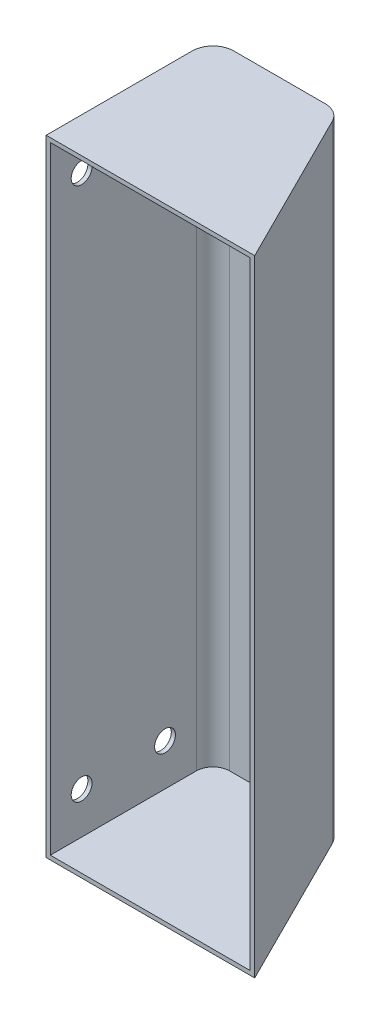
ISO-10303-21;
HEADER;
FILE_DESCRIPTION(('STEP AP214'),'2;1');
FILE_NAME('part.step','',(''),(''),'','','');
FILE_SCHEMA(('AUTOMOTIVE_DESIGN { 1 0 10303 214 1 1 1 1 }'));
ENDSEC;
DATA;
#1=APPLICATION_CONTEXT('core data for automotive mechanical design processes');
#2=APPLICATION_PROTOCOL_DEFINITION('international standard','automotive_design',2000,#1);
#3=PRODUCT_CONTEXT('',#1,'mechanical');
#4=PRODUCT('Part','Part','',(#3));
#5=PRODUCT_RELATED_PRODUCT_CATEGORY('part','',(#4));
#6=PRODUCT_DEFINITION_FORMATION('','',#4);
#7=PRODUCT_DEFINITION_CONTEXT('part definition',#1,'design');
#8=PRODUCT_DEFINITION('design','',#6,#7);
#9=PRODUCT_DEFINITION_SHAPE('','',#8);
#10=(LENGTH_UNIT() NAMED_UNIT(*) SI_UNIT(.MILLI.,.METRE.));
#11=(NAMED_UNIT(*) PLANE_ANGLE_UNIT() SI_UNIT($,.RADIAN.));
#12=(NAMED_UNIT(*) SI_UNIT($,.STERADIAN.) SOLID_ANGLE_UNIT());
#13=UNCERTAINTY_MEASURE_WITH_UNIT(LENGTH_MEASURE(1.E-05),#10,'distance_accuracy_value','');
#14=(GEOMETRIC_REPRESENTATION_CONTEXT(3) GLOBAL_UNCERTAINTY_ASSIGNED_CONTEXT((#13)) GLOBAL_UNIT_ASSIGNED_CONTEXT((#10,
#11,#12)) REPRESENTATION_CONTEXT('',''));
#15=CARTESIAN_POINT('',(0.,0.,0.));
#16=DIRECTION('',(0.,0.,1.));
#17=DIRECTION('',(1.,0.,0.));
#18=AXIS2_PLACEMENT_3D('',#15,#16,#17);
#19=CARTESIAN_POINT('',(50.,75.,40.));
#20=DIRECTION('',(0.,0.,-1.));
#21=DIRECTION('',(-1.,0.,0.));
#22=AXIS2_PLACEMENT_3D('',#19,#20,#21);
#23=PLANE('',#22);
#24=DIRECTION('',(1.,0.,0.));
#25=VECTOR('',#24,1.);
#26=CARTESIAN_POINT('',(50.,-75.,40.));
#27=LINE('',#26,#25);
#28=CARTESIAN_POINT('',(-4.9071207729675E-12,-75.,40.));
#29=VERTEX_POINT('',#28);
#30=CARTESIAN_POINT('',(50.,-75.,40.));
#31=VERTEX_POINT('',#30);
#32=EDGE_CURVE('E146',#29,#31,#27,.T.);
#33=ORIENTED_EDGE('',*,*,#32,.T.);
#34=DIRECTION('',(0.,-1.,0.));
#35=VECTOR('',#34,1.);
#36=CARTESIAN_POINT('',(50.,75.,40.));
#37=LINE('',#36,#35);
#38=CARTESIAN_POINT('',(50.,75.,40.));
#39=VERTEX_POINT('',#38);
#40=EDGE_CURVE('E11',#39,#31,#37,.T.);
#41=ORIENTED_EDGE('',*,*,#40,.F.);
#42=DIRECTION('',(1.,0.,0.));
#43=VECTOR('',#42,1.);
#44=CARTESIAN_POINT('',(50.,75.,40.));
#45=LINE('',#44,#43);
#46=CARTESIAN_POINT('',(-4.9071207729675E-12,75.,40.));
#47=VERTEX_POINT('',#46);
#48=EDGE_CURVE('E164',#47,#39,#45,.T.);
#49=ORIENTED_EDGE('',*,*,#48,.F.);
#50=DIRECTION('',(0.,-1.,0.));
#51=VECTOR('',#50,1.);
#52=CARTESIAN_POINT('',(-4.9071207729675E-12,75.,40.));
#53=LINE('',#52,#51);
#54=EDGE_CURVE('E142',#47,#29,#53,.T.);
#55=ORIENTED_EDGE('',*,*,#54,.T.);
#56=EDGE_LOOP('',(#33,#41,#49,#55));
#57=FACE_BOUND('',#56,.T.);
#58=DIRECTION('',(1.,0.,0.));
#59=VECTOR('',#58,1.);
#60=CARTESIAN_POINT('',(4.99999999999939,-74.,40.));
#61=LINE('',#60,#59);
#62=CARTESIAN_POINT('',(0.999999999995093,-74.,40.));
#63=VERTEX_POINT('',#62);
#64=CARTESIAN_POINT('',(48.8819660112501,-74.,40.));
#65=VERTEX_POINT('',#64);
#66=EDGE_CURVE('E188',#63,#65,#61,.T.);
#67=ORIENTED_EDGE('',*,*,#66,.F.);
#68=DIRECTION('',(0.,-1.,0.));
#69=VECTOR('',#68,1.);
#70=CARTESIAN_POINT('',(0.999999999995095,75.,40.));
#71=LINE('',#70,#69);
#72=CARTESIAN_POINT('',(0.999999999995093,74.,40.));
#73=VERTEX_POINT('',#72);
#74=EDGE_CURVE('E195',#73,#63,#71,.T.);
#75=ORIENTED_EDGE('',*,*,#74,.F.);
#76=DIRECTION('',(1.,0.,0.));
#77=VECTOR('',#76,1.);
#78=CARTESIAN_POINT('',(4.99999999999939,74.,40.));
#79=LINE('',#78,#77);
#80=CARTESIAN_POINT('',(48.8819660112501,74.,40.));
#81=VERTEX_POINT('',#80);
#82=EDGE_CURVE('E60',#73,#81,#79,.T.);
#83=ORIENTED_EDGE('',*,*,#82,.T.);
#84=DIRECTION('',(0.,-1.,0.));
#85=VECTOR('',#84,1.);
#86=CARTESIAN_POINT('',(48.8819660112501,75.,40.));
#87=LINE('',#86,#85);
#88=EDGE_CURVE('E151',#81,#65,#87,.T.);
#89=ORIENTED_EDGE('',*,*,#88,.T.);
#90=EDGE_LOOP('',(#67,#75,#83,#89));
#91=FACE_BOUND('',#90,.T.);
#92=ADVANCED_FACE('F45',(#57,#91),#23,.F.);
#93=CARTESIAN_POINT('',(31.3819660112501,75.,2.76393202250023));
#94=DIRECTION('',(-0.894427190999916,0.,0.447213595499958));
#95=DIRECTION('',(0.447213595499958,0.,0.894427190999916));
#96=AXIS2_PLACEMENT_3D('',#93,#94,#95);
#97=PLANE('',#96);
#98=DIRECTION('',(-0.447213595499958,0.,-0.894427190999916));
#99=VECTOR('',#98,1.);
#100=CARTESIAN_POINT('',(31.3819660112501,-75.,2.76393202250023));
#101=LINE('',#100,#99);
#102=CARTESIAN_POINT('',(31.3819660112501,-75.,2.76393202250023));
#103=VERTEX_POINT('',#102);
#104=EDGE_CURVE('E150',#31,#103,#101,.T.);
#105=ORIENTED_EDGE('',*,*,#104,.T.);
#106=DIRECTION('',(0.,-1.,0.));
#107=VECTOR('',#106,1.);
#108=CARTESIAN_POINT('',(31.3819660112501,75.,2.76393202250023));
#109=LINE('',#108,#107);
#110=CARTESIAN_POINT('',(31.3819660112501,75.,2.76393202250023));
#111=VERTEX_POINT('',#110);
#112=EDGE_CURVE('E53',#111,#103,#109,.T.);
#113=ORIENTED_EDGE('',*,*,#112,.F.);
#114=DIRECTION('',(-0.447213595499958,0.,-0.894427190999916));
#115=VECTOR('',#114,1.);
#116=CARTESIAN_POINT('',(31.3819660112501,75.,2.76393202250023));
#117=LINE('',#116,#115);
#118=EDGE_CURVE('E104',#39,#111,#117,.T.);
#119=ORIENTED_EDGE('',*,*,#118,.F.);
#120=ORIENTED_EDGE('',*,*,#40,.T.);
#121=EDGE_LOOP('',(#105,#113,#119,#120));
#122=FACE_BOUND('',#121,.T.);
#123=ADVANCED_FACE('F317',(#122),#97,.F.);
#124=CARTESIAN_POINT('',(26.9098300562505,75.,5.));
#125=DIRECTION('',(0.,-1.,0.));
#126=DIRECTION('',(0.,0.,-1.));
#127=AXIS2_PLACEMENT_3D('',#124,#125,#126);
#128=CYLINDRICAL_SURFACE('',#127,5.);
#129=CARTESIAN_POINT('',(26.9098300562505,-75.,5.));
#130=DIRECTION('',(0.,1.,0.));
#131=DIRECTION('',(0.,0.,-1.));
#132=AXIS2_PLACEMENT_3D('',#129,#130,#131);
#133=CIRCLE('',#132,5.);
#134=CARTESIAN_POINT('',(26.9098300562505,-75.,0.));
#135=VERTEX_POINT('',#134);
#136=EDGE_CURVE('E154',#103,#135,#133,.T.);
#137=ORIENTED_EDGE('',*,*,#136,.T.);
#138=DIRECTION('',(0.,-1.,0.));
#139=VECTOR('',#138,1.);
#140=CARTESIAN_POINT('',(26.9098300562505,75.,0.));
#141=LINE('',#140,#139);
#142=CARTESIAN_POINT('',(26.9098300562505,75.,0.));
#143=VERTEX_POINT('',#142);
#144=EDGE_CURVE('E135',#143,#135,#141,.T.);
#145=ORIENTED_EDGE('',*,*,#144,.F.);
#146=CARTESIAN_POINT('',(26.9098300562505,75.,5.));
#147=DIRECTION('',(0.,1.,0.));
#148=DIRECTION('',(0.,0.,-1.));
#149=AXIS2_PLACEMENT_3D('',#146,#147,#148);
#150=CIRCLE('',#149,5.);
#151=EDGE_CURVE('E121',#111,#143,#150,.T.);
#152=ORIENTED_EDGE('',*,*,#151,.F.);
#153=ORIENTED_EDGE('',*,*,#112,.T.);
#154=EDGE_LOOP('',(#137,#145,#152,#153));
#155=FACE_BOUND('',#154,.T.);
#156=ADVANCED_FACE('F174',(#155),#128,.T.);
#157=CARTESIAN_POINT('',(4.99999999999942,75.,0.));
#158=DIRECTION('',(0.,0.,1.));
#159=DIRECTION('',(1.,0.,0.));
#160=AXIS2_PLACEMENT_3D('',#157,#158,#159);
#161=PLANE('',#160);
#162=DIRECTION('',(-1.,0.,0.));
#163=VECTOR('',#162,1.);
#164=CARTESIAN_POINT('',(4.99999999999942,-75.,0.));
#165=LINE('',#164,#163);
#166=CARTESIAN_POINT('',(4.99999999999939,-75.,0.));
#167=VERTEX_POINT('',#166);
#168=EDGE_CURVE('E131',#135,#167,#165,.T.);
#169=ORIENTED_EDGE('',*,*,#168,.T.);
#170=DIRECTION('',(0.,-1.,0.));
#171=VECTOR('',#170,1.);
#172=CARTESIAN_POINT('',(4.99999999999939,75.,0.));
#173=LINE('',#172,#171);
#174=CARTESIAN_POINT('',(4.99999999999939,75.,0.));
#175=VERTEX_POINT('',#174);
#176=EDGE_CURVE('E128',#175,#167,#173,.T.);
#177=ORIENTED_EDGE('',*,*,#176,.F.);
#178=DIRECTION('',(-1.,0.,0.));
#179=VECTOR('',#178,1.);
#180=CARTESIAN_POINT('',(4.99999999999942,75.,0.));
#181=LINE('',#180,#179);
#182=EDGE_CURVE('E114',#143,#175,#181,.T.);
#183=ORIENTED_EDGE('',*,*,#182,.F.);
#184=ORIENTED_EDGE('',*,*,#144,.T.);
#185=EDGE_LOOP('',(#169,#177,#183,#184));
#186=FACE_BOUND('',#185,.T.);
#187=ADVANCED_FACE('F129',(#186),#161,.F.);
#188=CARTESIAN_POINT('',(4.99999999999939,75.,5.));
#189=DIRECTION('',(0.,-1.,0.));
#190=DIRECTION('',(0.,0.,-1.));
#191=AXIS2_PLACEMENT_3D('',#188,#189,#190);
#192=CYLINDRICAL_SURFACE('',#191,5.);
#193=CARTESIAN_POINT('',(4.99999999999939,-75.,5.));
#194=DIRECTION('',(0.,1.,0.));
#195=DIRECTION('',(0.,0.,-1.));
#196=AXIS2_PLACEMENT_3D('',#193,#194,#195);
#197=CIRCLE('',#196,5.);
#198=CARTESIAN_POINT('',(-6.13390096620866E-13,-75.,4.99999999999942));
#199=VERTEX_POINT('',#198);
#200=EDGE_CURVE('E159',#167,#199,#197,.T.);
#201=ORIENTED_EDGE('',*,*,#200,.T.);
#202=DIRECTION('',(0.,-1.,0.));
#203=VECTOR('',#202,1.);
#204=CARTESIAN_POINT('',(-6.13390096620866E-13,75.,4.99999999999942));
#205=LINE('',#204,#203);
#206=CARTESIAN_POINT('',(-6.13390096620866E-13,75.,4.99999999999942));
#207=VERTEX_POINT('',#206);
#208=EDGE_CURVE('E136',#207,#199,#205,.T.);
#209=ORIENTED_EDGE('',*,*,#208,.F.);
#210=CARTESIAN_POINT('',(4.99999999999939,75.,5.));
#211=DIRECTION('',(0.,1.,0.));
#212=DIRECTION('',(0.,0.,-1.));
#213=AXIS2_PLACEMENT_3D('',#210,#211,#212);
#214=CIRCLE('',#213,5.);
#215=EDGE_CURVE('E118',#175,#207,#214,.T.);
#216=ORIENTED_EDGE('',*,*,#215,.F.);
#217=ORIENTED_EDGE('',*,*,#176,.T.);
#218=EDGE_LOOP('',(#201,#209,#216,#217));
#219=FACE_BOUND('',#218,.T.);
#220=ADVANCED_FACE('F138',(#219),#192,.T.);
#221=CARTESIAN_POINT('',(-4.9071207729675E-12,75.,40.));
#222=DIRECTION('',(1.,0.,1.22678019324187E-13));
#223=DIRECTION('',(1.22678019324187E-13,0.,-1.));
#224=AXIS2_PLACEMENT_3D('',#221,#222,#223);
#225=PLANE('',#224);
#226=CARTESIAN_POINT('',(-3.98703575173577E-12,64.,32.4999999999996));
#227=DIRECTION('',(1.,0.,1.22678019324187E-13));
#228=DIRECTION('',(1.22678019324187E-13,0.,-1.));
#229=AXIS2_PLACEMENT_3D('',#226,#227,#228);
#230=CIRCLE('',#229,2.50000000000001);
#231=CARTESIAN_POINT('',(-3.6803407034253E-12,64.,29.9999999999996));
#232=VERTEX_POINT('',#231);
#233=EDGE_CURVE('E271',#232,#232,#230,.F.);
#234=ORIENTED_EDGE('',*,*,#233,.F.);
#235=EDGE_LOOP('',(#234));
#236=FACE_BOUND('',#235,.T.);
#237=CARTESIAN_POINT('',(-1.53347522397276E-12,64.,12.4999999999997));
#238=DIRECTION('',(1.,0.,1.22678019324187E-13));
#239=DIRECTION('',(1.22678019324187E-13,0.,-1.));
#240=AXIS2_PLACEMENT_3D('',#237,#238,#239);
#241=CIRCLE('',#240,2.5);
#242=CARTESIAN_POINT('',(-1.2267801756623E-12,64.,9.99999999999966));
#243=VERTEX_POINT('',#242);
#244=EDGE_CURVE('E270',#243,#243,#241,.F.);
#245=ORIENTED_EDGE('',*,*,#244,.F.);
#246=EDGE_LOOP('',(#245));
#247=FACE_BOUND('',#246,.T.);
#248=CARTESIAN_POINT('',(-1.53347522397276E-12,-64.,12.4999999999997));
#249=DIRECTION('',(1.,0.,1.22678019324187E-13));
#250=DIRECTION('',(1.22678019324187E-13,0.,-1.));
#251=AXIS2_PLACEMENT_3D('',#248,#249,#250);
#252=CIRCLE('',#251,2.5);
#253=CARTESIAN_POINT('',(-1.22678017566229E-12,-64.,9.99999999999965));
#254=VERTEX_POINT('',#253);
#255=EDGE_CURVE('E279',#254,#254,#252,.F.);
#256=ORIENTED_EDGE('',*,*,#255,.F.);
#257=EDGE_LOOP('',(#256));
#258=FACE_BOUND('',#257,.T.);
#259=CARTESIAN_POINT('',(-3.98703575173577E-12,-64.,32.4999999999996));
#260=DIRECTION('',(1.,0.,1.22678019324187E-13));
#261=DIRECTION('',(1.22678019324187E-13,0.,-1.));
#262=AXIS2_PLACEMENT_3D('',#259,#260,#261);
#263=CIRCLE('',#262,2.5);
#264=CARTESIAN_POINT('',(-3.6803407034253E-12,-64.,29.9999999999996));
#265=VERTEX_POINT('',#264);
#266=EDGE_CURVE('E194',#265,#265,#263,.F.);
#267=ORIENTED_EDGE('',*,*,#266,.F.);
#268=EDGE_LOOP('',(#267));
#269=FACE_BOUND('',#268,.T.);
#270=DIRECTION('',(-1.22678019324187E-13,0.,1.));
#271=VECTOR('',#270,1.);
#272=CARTESIAN_POINT('',(-4.9071207729675E-12,-75.,40.));
#273=LINE('',#272,#271);
#274=EDGE_CURVE('E96',#199,#29,#273,.T.);
#275=ORIENTED_EDGE('',*,*,#274,.T.);
#276=ORIENTED_EDGE('',*,*,#54,.F.);
#277=DIRECTION('',(-1.22678019324187E-13,0.,1.));
#278=VECTOR('',#277,1.);
#279=CARTESIAN_POINT('',(-4.9071207729675E-12,75.,40.));
#280=LINE('',#279,#278);
#281=EDGE_CURVE('E69',#207,#47,#280,.T.);
#282=ORIENTED_EDGE('',*,*,#281,.F.);
#283=ORIENTED_EDGE('',*,*,#208,.T.);
#284=EDGE_LOOP('',(#275,#276,#282,#283));
#285=FACE_BOUND('',#284,.T.);
#286=ADVANCED_FACE('F178',(#236,#247,#258,#269,#285),#225,.F.);
#287=CARTESIAN_POINT('',(4.99999999999939,75.,5.));
#288=DIRECTION('',(0.,-1.,0.));
#289=DIRECTION('',(0.,0.,-1.));
#290=AXIS2_PLACEMENT_3D('',#287,#288,#289);
#291=PLANE('',#290);
#292=ORIENTED_EDGE('',*,*,#48,.T.);
#293=ORIENTED_EDGE('',*,*,#118,.T.);
#294=ORIENTED_EDGE('',*,*,#151,.T.);
#295=ORIENTED_EDGE('',*,*,#182,.T.);
#296=ORIENTED_EDGE('',*,*,#215,.T.);
#297=ORIENTED_EDGE('',*,*,#281,.T.);
#298=EDGE_LOOP('',(#292,#293,#294,#295,#296,#297));
#299=FACE_BOUND('',#298,.T.);
#300=ADVANCED_FACE('F116',(#299),#291,.F.);
#301=CARTESIAN_POINT('',(4.99999999999939,-75.,5.));
#302=DIRECTION('',(0.,-1.,0.));
#303=DIRECTION('',(0.,0.,-1.));
#304=AXIS2_PLACEMENT_3D('',#301,#302,#303);
#305=PLANE('',#304);
#306=ORIENTED_EDGE('',*,*,#32,.F.);
#307=ORIENTED_EDGE('',*,*,#274,.F.);
#308=ORIENTED_EDGE('',*,*,#200,.F.);
#309=ORIENTED_EDGE('',*,*,#168,.F.);
#310=ORIENTED_EDGE('',*,*,#136,.F.);
#311=ORIENTED_EDGE('',*,*,#104,.F.);
#312=EDGE_LOOP('',(#306,#307,#308,#309,#310,#311));
#313=FACE_BOUND('',#312,.T.);
#314=ADVANCED_FACE('F177',(#313),#305,.T.);
#315=CARTESIAN_POINT('',(30.4875388202502,75.,3.21114561800019));
#316=DIRECTION('',(-0.894427190999916,0.,0.447213595499958));
#317=DIRECTION('',(0.447213595499958,0.,0.894427190999916));
#318=AXIS2_PLACEMENT_3D('',#315,#316,#317);
#319=PLANE('',#318);
#320=DIRECTION('',(-0.447213595499958,0.,-0.894427190999916));
#321=VECTOR('',#320,1.);
#322=CARTESIAN_POINT('',(26.105572809,-74.,-5.55278640450029));
#323=LINE('',#322,#321);
#324=CARTESIAN_POINT('',(30.4875388202502,-74.,3.21114561800018));
#325=VERTEX_POINT('',#324);
#326=EDGE_CURVE('E193',#65,#325,#323,.T.);
#327=ORIENTED_EDGE('',*,*,#326,.F.);
#328=ORIENTED_EDGE('',*,*,#88,.F.);
#329=DIRECTION('',(-0.447213595499958,0.,-0.894427190999916));
#330=VECTOR('',#329,1.);
#331=CARTESIAN_POINT('',(26.105572809,74.,-5.55278640450029));
#332=LINE('',#331,#330);
#333=CARTESIAN_POINT('',(30.4875388202502,74.,3.21114561800018));
#334=VERTEX_POINT('',#333);
#335=EDGE_CURVE('E203',#81,#334,#332,.T.);
#336=ORIENTED_EDGE('',*,*,#335,.T.);
#337=DIRECTION('',(0.,-1.,0.));
#338=VECTOR('',#337,1.);
#339=CARTESIAN_POINT('',(30.4875388202502,75.,3.21114561800018));
#340=LINE('',#339,#338);
#341=EDGE_CURVE('E208',#334,#325,#340,.T.);
#342=ORIENTED_EDGE('',*,*,#341,.T.);
#343=EDGE_LOOP('',(#327,#328,#336,#342));
#344=FACE_BOUND('',#343,.T.);
#345=ADVANCED_FACE('F333',(#344),#319,.T.);
#346=CARTESIAN_POINT('',(26.9098300562505,75.,5.));
#347=DIRECTION('',(0.,-1.,0.));
#348=DIRECTION('',(0.,0.,-1.));
#349=AXIS2_PLACEMENT_3D('',#346,#347,#348);
#350=CYLINDRICAL_SURFACE('',#349,4.);
#351=CARTESIAN_POINT('',(26.9098300562505,-74.,5.));
#352=DIRECTION('',(0.,-1.,0.));
#353=DIRECTION('',(0.,0.,-1.));
#354=AXIS2_PLACEMENT_3D('',#351,#352,#353);
#355=CIRCLE('',#354,4.);
#356=CARTESIAN_POINT('',(26.9098300562505,-74.,0.999999999999997));
#357=VERTEX_POINT('',#356);
#358=EDGE_CURVE('E239',#325,#357,#355,.F.);
#359=ORIENTED_EDGE('',*,*,#358,.F.);
#360=ORIENTED_EDGE('',*,*,#341,.F.);
#361=CARTESIAN_POINT('',(26.9098300562505,74.,5.));
#362=DIRECTION('',(0.,-1.,0.));
#363=DIRECTION('',(0.,0.,-1.));
#364=AXIS2_PLACEMENT_3D('',#361,#362,#363);
#365=CIRCLE('',#364,4.);
#366=CARTESIAN_POINT('',(26.9098300562505,74.,0.999999999999997));
#367=VERTEX_POINT('',#366);
#368=EDGE_CURVE('E231',#334,#367,#365,.F.);
#369=ORIENTED_EDGE('',*,*,#368,.T.);
#370=DIRECTION('',(0.,1.,0.));
#371=VECTOR('',#370,1.);
#372=CARTESIAN_POINT('',(26.9098300562505,75.,0.999999999999997));
#373=LINE('',#372,#371);
#374=EDGE_CURVE('E235',#367,#357,#373,.F.);
#375=ORIENTED_EDGE('',*,*,#374,.T.);
#376=EDGE_LOOP('',(#359,#360,#369,#375));
#377=FACE_BOUND('',#376,.T.);
#378=ADVANCED_FACE('F348',(#377),#350,.F.);
#379=CARTESIAN_POINT('',(4.99999999999942,75.,0.999999999999999));
#380=DIRECTION('',(0.,0.,1.));
#381=DIRECTION('',(1.,0.,0.));
#382=AXIS2_PLACEMENT_3D('',#379,#380,#381);
#383=PLANE('',#382);
#384=DIRECTION('',(-1.,0.,0.));
#385=VECTOR('',#384,1.);
#386=CARTESIAN_POINT('',(4.99999999999939,-74.,0.999999999999999));
#387=LINE('',#386,#385);
#388=CARTESIAN_POINT('',(4.99999999999939,-74.,0.999999999999999));
#389=VERTEX_POINT('',#388);
#390=EDGE_CURVE('E227',#357,#389,#387,.T.);
#391=ORIENTED_EDGE('',*,*,#390,.F.);
#392=ORIENTED_EDGE('',*,*,#374,.F.);
#393=DIRECTION('',(-1.,0.,0.));
#394=VECTOR('',#393,1.);
#395=CARTESIAN_POINT('',(4.99999999999939,74.,0.999999999999999));
#396=LINE('',#395,#394);
#397=CARTESIAN_POINT('',(4.99999999999939,74.,0.999999999999999));
#398=VERTEX_POINT('',#397);
#399=EDGE_CURVE('E219',#367,#398,#396,.T.);
#400=ORIENTED_EDGE('',*,*,#399,.T.);
#401=DIRECTION('',(0.,-1.,0.));
#402=VECTOR('',#401,1.);
#403=CARTESIAN_POINT('',(4.99999999999939,75.,0.999999999999999));
#404=LINE('',#403,#402);
#405=EDGE_CURVE('E223',#398,#389,#404,.T.);
#406=ORIENTED_EDGE('',*,*,#405,.T.);
#407=EDGE_LOOP('',(#391,#392,#400,#406));
#408=FACE_BOUND('',#407,.T.);
#409=ADVANCED_FACE('F344',(#408),#383,.T.);
#410=CARTESIAN_POINT('',(4.99999999999939,75.,5.));
#411=DIRECTION('',(0.,-1.,0.));
#412=DIRECTION('',(0.,0.,-1.));
#413=AXIS2_PLACEMENT_3D('',#410,#411,#412);
#414=CYLINDRICAL_SURFACE('',#413,4.);
#415=CARTESIAN_POINT('',(4.99999999999939,-74.,5.));
#416=DIRECTION('',(0.,-1.,0.));
#417=DIRECTION('',(0.,0.,-1.));
#418=AXIS2_PLACEMENT_3D('',#415,#416,#417);
#419=CIRCLE('',#418,4.);
#420=CARTESIAN_POINT('',(0.999999999999387,-74.,4.99999999999955));
#421=VERTEX_POINT('',#420);
#422=EDGE_CURVE('E215',#389,#421,#419,.F.);
#423=ORIENTED_EDGE('',*,*,#422,.F.);
#424=ORIENTED_EDGE('',*,*,#405,.F.);
#425=CARTESIAN_POINT('',(4.99999999999939,74.,5.));
#426=DIRECTION('',(0.,-1.,0.));
#427=DIRECTION('',(0.,0.,-1.));
#428=AXIS2_PLACEMENT_3D('',#425,#426,#427);
#429=CIRCLE('',#428,4.);
#430=CARTESIAN_POINT('',(0.999999999999387,74.,4.99999999999955));
#431=VERTEX_POINT('',#430);
#432=EDGE_CURVE('E211',#398,#431,#429,.F.);
#433=ORIENTED_EDGE('',*,*,#432,.T.);
#434=DIRECTION('',(0.,1.,0.));
#435=VECTOR('',#434,1.);
#436=CARTESIAN_POINT('',(0.999999999999387,75.,4.99999999999955));
#437=LINE('',#436,#435);
#438=EDGE_CURVE('E199',#431,#421,#437,.F.);
#439=ORIENTED_EDGE('',*,*,#438,.T.);
#440=EDGE_LOOP('',(#423,#424,#433,#439));
#441=FACE_BOUND('',#440,.T.);
#442=ADVANCED_FACE('F340',(#441),#414,.F.);
#443=CARTESIAN_POINT('',(0.999999999995093,75.,40.0000000000001));
#444=DIRECTION('',(1.,0.,1.22678019324187E-13));
#445=DIRECTION('',(1.22678019324187E-13,0.,-1.));
#446=AXIS2_PLACEMENT_3D('',#443,#444,#445);
#447=PLANE('',#446);
#448=CARTESIAN_POINT('',(0.999999999996013,64.,32.4999999999998));
#449=DIRECTION('',(1.,0.,1.22678019324187E-13));
#450=DIRECTION('',(-1.22678019324187E-13,0.,1.));
#451=AXIS2_PLACEMENT_3D('',#448,#449,#450);
#452=CIRCLE('',#451,2.50000000000001);
#453=CARTESIAN_POINT('',(0.999999999995706,64.,34.9999999999998));
#454=VERTEX_POINT('',#453);
#455=EDGE_CURVE('E266',#454,#454,#452,.T.);
#456=ORIENTED_EDGE('',*,*,#455,.F.);
#457=EDGE_LOOP('',(#456));
#458=FACE_BOUND('',#457,.T.);
#459=CARTESIAN_POINT('',(0.999999999998467,64.,12.4999999999998));
#460=DIRECTION('',(1.,0.,1.22678019324187E-13));
#461=DIRECTION('',(1.22678019324187E-13,0.,-1.));
#462=AXIS2_PLACEMENT_3D('',#459,#460,#461);
#463=CIRCLE('',#462,2.5);
#464=CARTESIAN_POINT('',(0.999999999998773,64.,9.99999999999978));
#465=VERTEX_POINT('',#464);
#466=EDGE_CURVE('E275',#465,#465,#463,.T.);
#467=ORIENTED_EDGE('',*,*,#466,.F.);
#468=EDGE_LOOP('',(#467));
#469=FACE_BOUND('',#468,.T.);
#470=CARTESIAN_POINT('',(0.999999999998467,-64.,12.4999999999998));
#471=DIRECTION('',(1.,0.,1.22678019324187E-13));
#472=DIRECTION('',(-1.22678019324187E-13,0.,1.));
#473=AXIS2_PLACEMENT_3D('',#470,#471,#472);
#474=CIRCLE('',#473,2.5);
#475=CARTESIAN_POINT('',(0.99999999999816,-64.,14.9999999999998));
#476=VERTEX_POINT('',#475);
#477=EDGE_CURVE('E265',#476,#476,#474,.T.);
#478=ORIENTED_EDGE('',*,*,#477,.F.);
#479=EDGE_LOOP('',(#478));
#480=FACE_BOUND('',#479,.T.);
#481=CARTESIAN_POINT('',(0.999999999996013,-64.,32.4999999999998));
#482=DIRECTION('',(1.,0.,1.22678019324187E-13));
#483=DIRECTION('',(1.22678019324187E-13,0.,-1.));
#484=AXIS2_PLACEMENT_3D('',#481,#482,#483);
#485=CIRCLE('',#484,2.5);
#486=CARTESIAN_POINT('',(0.99999999999632,-64.,29.9999999999998));
#487=VERTEX_POINT('',#486);
#488=EDGE_CURVE('E261',#487,#487,#485,.T.);
#489=ORIENTED_EDGE('',*,*,#488,.F.);
#490=EDGE_LOOP('',(#489));
#491=FACE_BOUND('',#490,.T.);
#492=DIRECTION('',(-1.22678019324187E-13,0.,1.));
#493=VECTOR('',#492,1.);
#494=CARTESIAN_POINT('',(0.999999999999387,-74.,4.99999999999951));
#495=LINE('',#494,#493);
#496=EDGE_CURVE('E204',#421,#63,#495,.T.);
#497=ORIENTED_EDGE('',*,*,#496,.F.);
#498=ORIENTED_EDGE('',*,*,#438,.F.);
#499=DIRECTION('',(-1.22678019324187E-13,0.,1.));
#500=VECTOR('',#499,1.);
#501=CARTESIAN_POINT('',(0.999999999999387,74.,4.99999999999951));
#502=LINE('',#501,#500);
#503=EDGE_CURVE('E200',#431,#73,#502,.T.);
#504=ORIENTED_EDGE('',*,*,#503,.T.);
#505=ORIENTED_EDGE('',*,*,#74,.T.);
#506=EDGE_LOOP('',(#497,#498,#504,#505));
#507=FACE_BOUND('',#506,.T.);
#508=ADVANCED_FACE('F338',(#458,#469,#480,#491,#507),#447,.T.);
#509=CARTESIAN_POINT('',(4.99999999999939,74.,5.));
#510=DIRECTION('',(0.,-1.,0.));
#511=DIRECTION('',(0.,0.,-1.));
#512=AXIS2_PLACEMENT_3D('',#509,#510,#511);
#513=PLANE('',#512);
#514=ORIENTED_EDGE('',*,*,#82,.F.);
#515=ORIENTED_EDGE('',*,*,#503,.F.);
#516=ORIENTED_EDGE('',*,*,#432,.F.);
#517=ORIENTED_EDGE('',*,*,#399,.F.);
#518=ORIENTED_EDGE('',*,*,#368,.F.);
#519=ORIENTED_EDGE('',*,*,#335,.F.);
#520=EDGE_LOOP('',(#514,#515,#516,#517,#518,#519));
#521=FACE_BOUND('',#520,.T.);
#522=ADVANCED_FACE('F311',(#521),#513,.T.);
#523=CARTESIAN_POINT('',(4.99999999999939,-74.,5.));
#524=DIRECTION('',(0.,-1.,0.));
#525=DIRECTION('',(0.,0.,-1.));
#526=AXIS2_PLACEMENT_3D('',#523,#524,#525);
#527=PLANE('',#526);
#528=ORIENTED_EDGE('',*,*,#66,.T.);
#529=ORIENTED_EDGE('',*,*,#326,.T.);
#530=ORIENTED_EDGE('',*,*,#358,.T.);
#531=ORIENTED_EDGE('',*,*,#390,.T.);
#532=ORIENTED_EDGE('',*,*,#422,.T.);
#533=ORIENTED_EDGE('',*,*,#496,.T.);
#534=EDGE_LOOP('',(#528,#529,#530,#531,#532,#533));
#535=FACE_BOUND('',#534,.T.);
#536=ADVANCED_FACE('F300',(#535),#527,.F.);
#537=CARTESIAN_POINT('',(-0.00100000000889406,-64.,32.4999999999996));
#538=DIRECTION('',(1.,0.,1.22678019324187E-13));
#539=DIRECTION('',(1.22678019324187E-13,0.,-1.));
#540=AXIS2_PLACEMENT_3D('',#537,#538,#539);
#541=CYLINDRICAL_SURFACE('',#540,2.5);
#542=ORIENTED_EDGE('',*,*,#488,.T.);
#543=EDGE_LOOP('',(#542));
#544=FACE_BOUND('',#543,.T.);
#545=ORIENTED_EDGE('',*,*,#266,.T.);
#546=EDGE_LOOP('',(#545));
#547=FACE_BOUND('',#546,.T.);
#548=ADVANCED_FACE('F298',(#544,#547),#541,.F.);
#549=CARTESIAN_POINT('',(-0.00100000000644051,-64.,12.4999999999997));
#550=DIRECTION('',(1.,0.,1.22678019324187E-13));
#551=DIRECTION('',(1.22678019324187E-13,0.,-1.));
#552=AXIS2_PLACEMENT_3D('',#549,#550,#551);
#553=CYLINDRICAL_SURFACE('',#552,2.5);
#554=ORIENTED_EDGE('',*,*,#477,.T.);
#555=EDGE_LOOP('',(#554));
#556=FACE_BOUND('',#555,.T.);
#557=ORIENTED_EDGE('',*,*,#255,.T.);
#558=EDGE_LOOP('',(#557));
#559=FACE_BOUND('',#558,.T.);
#560=ADVANCED_FACE('F290',(#556,#559),#553,.F.);
#561=CARTESIAN_POINT('',(-0.00100000000644051,64.,12.4999999999997));
#562=DIRECTION('',(1.,0.,1.22678019324187E-13));
#563=DIRECTION('',(1.22678019324187E-13,0.,-1.));
#564=AXIS2_PLACEMENT_3D('',#561,#562,#563);
#565=CYLINDRICAL_SURFACE('',#564,2.5);
#566=ORIENTED_EDGE('',*,*,#466,.T.);
#567=EDGE_LOOP('',(#566));
#568=FACE_BOUND('',#567,.T.);
#569=ORIENTED_EDGE('',*,*,#244,.T.);
#570=EDGE_LOOP('',(#569));
#571=FACE_BOUND('',#570,.T.);
#572=ADVANCED_FACE('F307',(#568,#571),#565,.F.);
#573=CARTESIAN_POINT('',(-0.00100000000889406,64.,32.4999999999996));
#574=DIRECTION('',(1.,0.,1.22678019324187E-13));
#575=DIRECTION('',(1.22678019324187E-13,0.,-1.));
#576=AXIS2_PLACEMENT_3D('',#573,#574,#575);
#577=CYLINDRICAL_SURFACE('',#576,2.50000000000001);
#578=ORIENTED_EDGE('',*,*,#455,.T.);
#579=EDGE_LOOP('',(#578));
#580=FACE_BOUND('',#579,.T.);
#581=ORIENTED_EDGE('',*,*,#233,.T.);
#582=EDGE_LOOP('',(#581));
#583=FACE_BOUND('',#582,.T.);
#584=ADVANCED_FACE('F448',(#580,#583),#577,.F.);
#585=CLOSED_SHELL('',(#92,#123,#156,#187,#220,#286,#300,#314,#345,#378,#409,#442,#508,#522,#536,
#548,#560,#572,#584));
#586=MANIFOLD_SOLID_BREP('B2',#585);
#587=ADVANCED_BREP_SHAPE_REPRESENTATION('',(#18,#586),#14);
#588=SHAPE_DEFINITION_REPRESENTATION(#9,#587);
ENDSEC;
END-ISO-10303-21;
